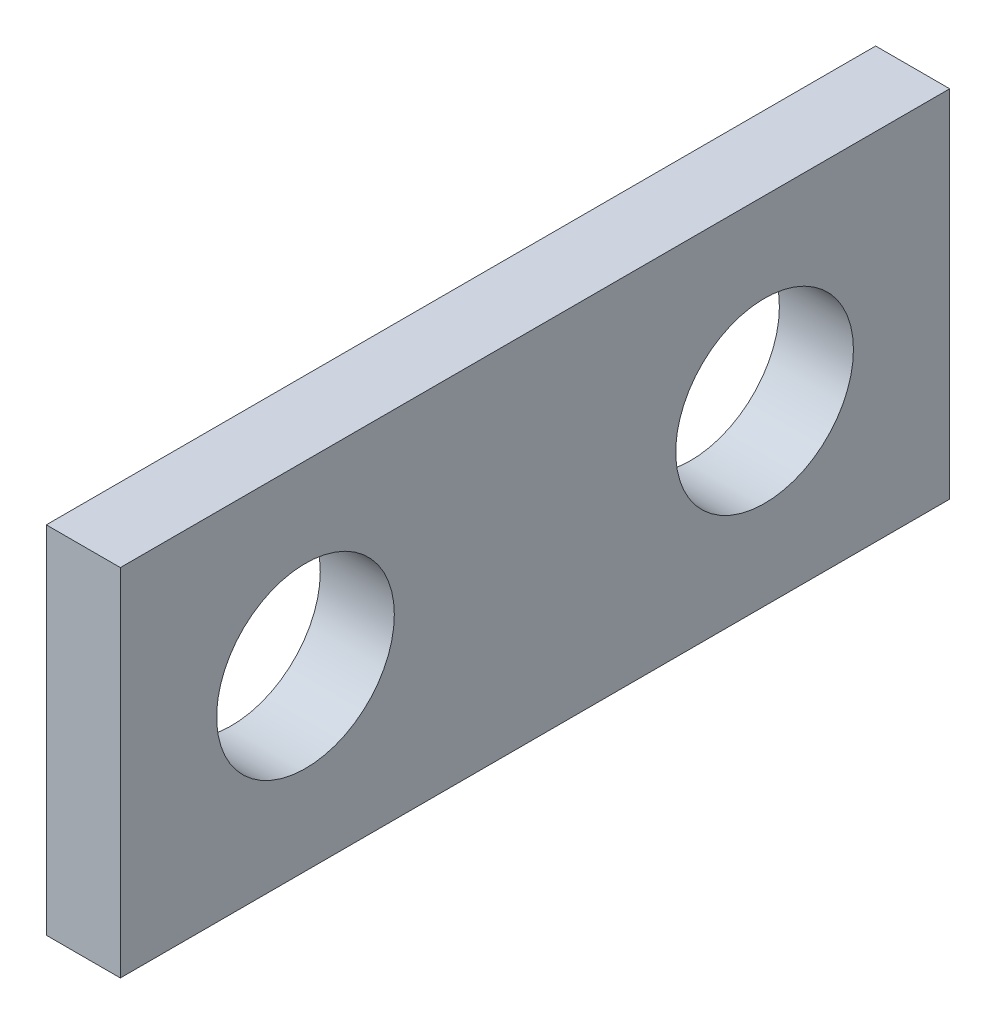
ISO-10303-21;
HEADER;
FILE_DESCRIPTION(('STEP AP214'),'2;1');
FILE_NAME('part.step','',(''),(''),'','','');
FILE_SCHEMA(('AUTOMOTIVE_DESIGN { 1 0 10303 214 1 1 1 1 }'));
ENDSEC;
DATA;
#1=APPLICATION_CONTEXT('core data for automotive mechanical design processes');
#2=APPLICATION_PROTOCOL_DEFINITION('international standard','automotive_design',2000,#1);
#3=PRODUCT_CONTEXT('',#1,'mechanical');
#4=PRODUCT('Part','Part','',(#3));
#5=PRODUCT_RELATED_PRODUCT_CATEGORY('part','',(#4));
#6=PRODUCT_DEFINITION_FORMATION('','',#4);
#7=PRODUCT_DEFINITION_CONTEXT('part definition',#1,'design');
#8=PRODUCT_DEFINITION('design','',#6,#7);
#9=PRODUCT_DEFINITION_SHAPE('','',#8);
#10=(LENGTH_UNIT() NAMED_UNIT(*) SI_UNIT(.MILLI.,.METRE.));
#11=(NAMED_UNIT(*) PLANE_ANGLE_UNIT() SI_UNIT($,.RADIAN.));
#12=(NAMED_UNIT(*) SI_UNIT($,.STERADIAN.) SOLID_ANGLE_UNIT());
#13=UNCERTAINTY_MEASURE_WITH_UNIT(LENGTH_MEASURE(1.E-05),#10,'distance_accuracy_value','');
#14=(GEOMETRIC_REPRESENTATION_CONTEXT(3) GLOBAL_UNCERTAINTY_ASSIGNED_CONTEXT((#13)) GLOBAL_UNIT_ASSIGNED_CONTEXT((#10,
#11,#12)) REPRESENTATION_CONTEXT('',''));
#15=CARTESIAN_POINT('',(0.,0.,0.));
#16=DIRECTION('',(0.,0.,1.));
#17=DIRECTION('',(1.,0.,0.));
#18=AXIS2_PLACEMENT_3D('',#15,#16,#17);
#19=CARTESIAN_POINT('',(5.,0.,0.));
#20=DIRECTION('',(-1.,0.,0.));
#21=DIRECTION('',(0.,0.,1.));
#22=AXIS2_PLACEMENT_3D('',#19,#20,#21);
#23=PLANE('',#22);
#24=DIRECTION('',(0.,1.,0.));
#25=VECTOR('',#24,1.);
#26=CARTESIAN_POINT('',(5.,-12.,-28.));
#27=LINE('',#26,#25);
#28=CARTESIAN_POINT('',(5.,-12.,-28.));
#29=VERTEX_POINT('',#28);
#30=CARTESIAN_POINT('',(5.,12.,-28.));
#31=VERTEX_POINT('',#30);
#32=EDGE_CURVE('E85',#29,#31,#27,.T.);
#33=ORIENTED_EDGE('',*,*,#32,.T.);
#34=DIRECTION('',(0.,0.,1.));
#35=VECTOR('',#34,1.);
#36=CARTESIAN_POINT('',(5.,12.,28.));
#37=LINE('',#36,#35);
#38=CARTESIAN_POINT('',(5.,12.,28.));
#39=VERTEX_POINT('',#38);
#40=EDGE_CURVE('E80',#31,#39,#37,.T.);
#41=ORIENTED_EDGE('',*,*,#40,.T.);
#42=DIRECTION('',(0.,-1.,0.));
#43=VECTOR('',#42,1.);
#44=CARTESIAN_POINT('',(5.,-12.,28.));
#45=LINE('',#44,#43);
#46=CARTESIAN_POINT('',(5.,-12.,28.));
#47=VERTEX_POINT('',#46);
#48=EDGE_CURVE('E83',#39,#47,#45,.T.);
#49=ORIENTED_EDGE('',*,*,#48,.T.);
#50=DIRECTION('',(0.,0.,-1.));
#51=VECTOR('',#50,1.);
#52=CARTESIAN_POINT('',(5.,-12.,28.));
#53=LINE('',#52,#51);
#54=EDGE_CURVE('E50',#47,#29,#53,.T.);
#55=ORIENTED_EDGE('',*,*,#54,.T.);
#56=EDGE_LOOP('',(#33,#41,#49,#55));
#57=FACE_BOUND('',#56,.T.);
#58=CARTESIAN_POINT('',(5.,0.,15.5));
#59=DIRECTION('',(1.,0.,0.));
#60=DIRECTION('',(0.,0.,-1.));
#61=AXIS2_PLACEMENT_3D('',#58,#59,#60);
#62=CIRCLE('',#61,6.);
#63=CARTESIAN_POINT('',(5.,0.,9.5));
#64=VERTEX_POINT('',#63);
#65=EDGE_CURVE('E100',#64,#64,#62,.T.);
#66=ORIENTED_EDGE('',*,*,#65,.F.);
#67=EDGE_LOOP('',(#66));
#68=FACE_BOUND('',#67,.T.);
#69=CARTESIAN_POINT('',(5.,0.,-15.5));
#70=DIRECTION('',(1.,0.,0.));
#71=DIRECTION('',(0.,0.,-1.));
#72=AXIS2_PLACEMENT_3D('',#69,#70,#71);
#73=CIRCLE('',#72,6.);
#74=CARTESIAN_POINT('',(5.,0.,-21.5));
#75=VERTEX_POINT('',#74);
#76=EDGE_CURVE('E115',#75,#75,#73,.T.);
#77=ORIENTED_EDGE('',*,*,#76,.F.);
#78=EDGE_LOOP('',(#77));
#79=FACE_BOUND('',#78,.T.);
#80=ADVANCED_FACE('F33',(#57,#68,#79),#23,.F.);
#81=CARTESIAN_POINT('',(0.,0.,0.));
#82=DIRECTION('',(-1.,0.,0.));
#83=DIRECTION('',(0.,0.,1.));
#84=AXIS2_PLACEMENT_3D('',#81,#82,#83);
#85=PLANE('',#84);
#86=CARTESIAN_POINT('',(0.,0.,15.5));
#87=DIRECTION('',(1.,0.,0.));
#88=DIRECTION('',(0.,0.,-1.));
#89=AXIS2_PLACEMENT_3D('',#86,#87,#88);
#90=CIRCLE('',#89,6.);
#91=CARTESIAN_POINT('',(0.,0.,9.5));
#92=VERTEX_POINT('',#91);
#93=EDGE_CURVE('E112',#92,#92,#90,.T.);
#94=ORIENTED_EDGE('',*,*,#93,.T.);
#95=EDGE_LOOP('',(#94));
#96=FACE_BOUND('',#95,.T.);
#97=DIRECTION('',(0.,1.,0.));
#98=VECTOR('',#97,1.);
#99=CARTESIAN_POINT('',(0.,-12.,-28.));
#100=LINE('',#99,#98);
#101=CARTESIAN_POINT('',(0.,-12.,-28.));
#102=VERTEX_POINT('',#101);
#103=CARTESIAN_POINT('',(0.,12.,-28.));
#104=VERTEX_POINT('',#103);
#105=EDGE_CURVE('E97',#102,#104,#100,.T.);
#106=ORIENTED_EDGE('',*,*,#105,.F.);
#107=DIRECTION('',(0.,0.,-1.));
#108=VECTOR('',#107,1.);
#109=CARTESIAN_POINT('',(0.,-12.,28.));
#110=LINE('',#109,#108);
#111=CARTESIAN_POINT('',(0.,-12.,28.));
#112=VERTEX_POINT('',#111);
#113=EDGE_CURVE('E73',#112,#102,#110,.T.);
#114=ORIENTED_EDGE('',*,*,#113,.F.);
#115=DIRECTION('',(0.,-1.,0.));
#116=VECTOR('',#115,1.);
#117=CARTESIAN_POINT('',(0.,-12.,28.));
#118=LINE('',#117,#116);
#119=CARTESIAN_POINT('',(0.,12.,28.));
#120=VERTEX_POINT('',#119);
#121=EDGE_CURVE('E67',#120,#112,#118,.T.);
#122=ORIENTED_EDGE('',*,*,#121,.F.);
#123=DIRECTION('',(0.,0.,1.));
#124=VECTOR('',#123,1.);
#125=CARTESIAN_POINT('',(0.,12.,28.));
#126=LINE('',#125,#124);
#127=EDGE_CURVE('E89',#104,#120,#126,.T.);
#128=ORIENTED_EDGE('',*,*,#127,.F.);
#129=EDGE_LOOP('',(#106,#114,#122,#128));
#130=FACE_BOUND('',#129,.T.);
#131=CARTESIAN_POINT('',(0.,0.,-15.5));
#132=DIRECTION('',(1.,0.,0.));
#133=DIRECTION('',(0.,0.,-1.));
#134=AXIS2_PLACEMENT_3D('',#131,#132,#133);
#135=CIRCLE('',#134,6.);
#136=CARTESIAN_POINT('',(0.,0.,-21.5));
#137=VERTEX_POINT('',#136);
#138=EDGE_CURVE('E118',#137,#137,#135,.T.);
#139=ORIENTED_EDGE('',*,*,#138,.T.);
#140=EDGE_LOOP('',(#139));
#141=FACE_BOUND('',#140,.T.);
#142=ADVANCED_FACE('F108',(#96,#130,#141),#85,.T.);
#143=CARTESIAN_POINT('',(5.,-12.,-28.));
#144=DIRECTION('',(0.,0.,1.));
#145=DIRECTION('',(1.,0.,0.));
#146=AXIS2_PLACEMENT_3D('',#143,#144,#145);
#147=PLANE('',#146);
#148=ORIENTED_EDGE('',*,*,#105,.T.);
#149=DIRECTION('',(-1.,0.,0.));
#150=VECTOR('',#149,1.);
#151=CARTESIAN_POINT('',(5.,12.,-28.));
#152=LINE('',#151,#150);
#153=EDGE_CURVE('E11',#31,#104,#152,.T.);
#154=ORIENTED_EDGE('',*,*,#153,.F.);
#155=ORIENTED_EDGE('',*,*,#32,.F.);
#156=DIRECTION('',(-1.,0.,0.));
#157=VECTOR('',#156,1.);
#158=CARTESIAN_POINT('',(5.,-12.,-28.));
#159=LINE('',#158,#157);
#160=EDGE_CURVE('E93',#29,#102,#159,.T.);
#161=ORIENTED_EDGE('',*,*,#160,.T.);
#162=EDGE_LOOP('',(#148,#154,#155,#161));
#163=FACE_BOUND('',#162,.T.);
#164=ADVANCED_FACE('F35',(#163),#147,.F.);
#165=CARTESIAN_POINT('',(5.,12.,28.));
#166=DIRECTION('',(0.,-1.,0.));
#167=DIRECTION('',(0.,0.,-1.));
#168=AXIS2_PLACEMENT_3D('',#165,#166,#167);
#169=PLANE('',#168);
#170=ORIENTED_EDGE('',*,*,#127,.T.);
#171=DIRECTION('',(-1.,0.,0.));
#172=VECTOR('',#171,1.);
#173=CARTESIAN_POINT('',(5.,12.,28.));
#174=LINE('',#173,#172);
#175=EDGE_CURVE('E42',#39,#120,#174,.T.);
#176=ORIENTED_EDGE('',*,*,#175,.F.);
#177=ORIENTED_EDGE('',*,*,#40,.F.);
#178=ORIENTED_EDGE('',*,*,#153,.T.);
#179=EDGE_LOOP('',(#170,#176,#177,#178));
#180=FACE_BOUND('',#179,.T.);
#181=ADVANCED_FACE('F88',(#180),#169,.F.);
#182=CARTESIAN_POINT('',(5.,-12.,28.));
#183=DIRECTION('',(0.,0.,-1.));
#184=DIRECTION('',(-1.,0.,0.));
#185=AXIS2_PLACEMENT_3D('',#182,#183,#184);
#186=PLANE('',#185);
#187=ORIENTED_EDGE('',*,*,#121,.T.);
#188=DIRECTION('',(-1.,0.,0.));
#189=VECTOR('',#188,1.);
#190=CARTESIAN_POINT('',(5.,-12.,28.));
#191=LINE('',#190,#189);
#192=EDGE_CURVE('E90',#47,#112,#191,.T.);
#193=ORIENTED_EDGE('',*,*,#192,.F.);
#194=ORIENTED_EDGE('',*,*,#48,.F.);
#195=ORIENTED_EDGE('',*,*,#175,.T.);
#196=EDGE_LOOP('',(#187,#193,#194,#195));
#197=FACE_BOUND('',#196,.T.);
#198=ADVANCED_FACE('F91',(#197),#186,.F.);
#199=CARTESIAN_POINT('',(5.,-12.,28.));
#200=DIRECTION('',(0.,1.,0.));
#201=DIRECTION('',(0.,0.,1.));
#202=AXIS2_PLACEMENT_3D('',#199,#200,#201);
#203=PLANE('',#202);
#204=ORIENTED_EDGE('',*,*,#113,.T.);
#205=ORIENTED_EDGE('',*,*,#160,.F.);
#206=ORIENTED_EDGE('',*,*,#54,.F.);
#207=ORIENTED_EDGE('',*,*,#192,.T.);
#208=EDGE_LOOP('',(#204,#205,#206,#207));
#209=FACE_BOUND('',#208,.T.);
#210=ADVANCED_FACE('F105',(#209),#203,.F.);
#211=CARTESIAN_POINT('',(5.,0.,15.5));
#212=DIRECTION('',(-1.,0.,0.));
#213=DIRECTION('',(0.,0.,1.));
#214=AXIS2_PLACEMENT_3D('',#211,#212,#213);
#215=CYLINDRICAL_SURFACE('',#214,6.);
#216=ORIENTED_EDGE('',*,*,#65,.T.);
#217=EDGE_LOOP('',(#216));
#218=FACE_BOUND('',#217,.T.);
#219=ORIENTED_EDGE('',*,*,#93,.F.);
#220=EDGE_LOOP('',(#219));
#221=FACE_BOUND('',#220,.T.);
#222=ADVANCED_FACE('F135',(#218,#221),#215,.F.);
#223=CARTESIAN_POINT('',(5.,0.,-15.5));
#224=DIRECTION('',(-1.,0.,0.));
#225=DIRECTION('',(0.,0.,1.));
#226=AXIS2_PLACEMENT_3D('',#223,#224,#225);
#227=CYLINDRICAL_SURFACE('',#226,6.);
#228=ORIENTED_EDGE('',*,*,#76,.T.);
#229=EDGE_LOOP('',(#228));
#230=FACE_BOUND('',#229,.T.);
#231=ORIENTED_EDGE('',*,*,#138,.F.);
#232=EDGE_LOOP('',(#231));
#233=FACE_BOUND('',#232,.T.);
#234=ADVANCED_FACE('F124',(#230,#233),#227,.F.);
#235=CLOSED_SHELL('',(#80,#142,#164,#181,#198,#210,#222,#234));
#236=MANIFOLD_SOLID_BREP('B2',#235);
#237=ADVANCED_BREP_SHAPE_REPRESENTATION('',(#18,#236),#14);
#238=SHAPE_DEFINITION_REPRESENTATION(#9,#237);
ENDSEC;
END-ISO-10303-21;
